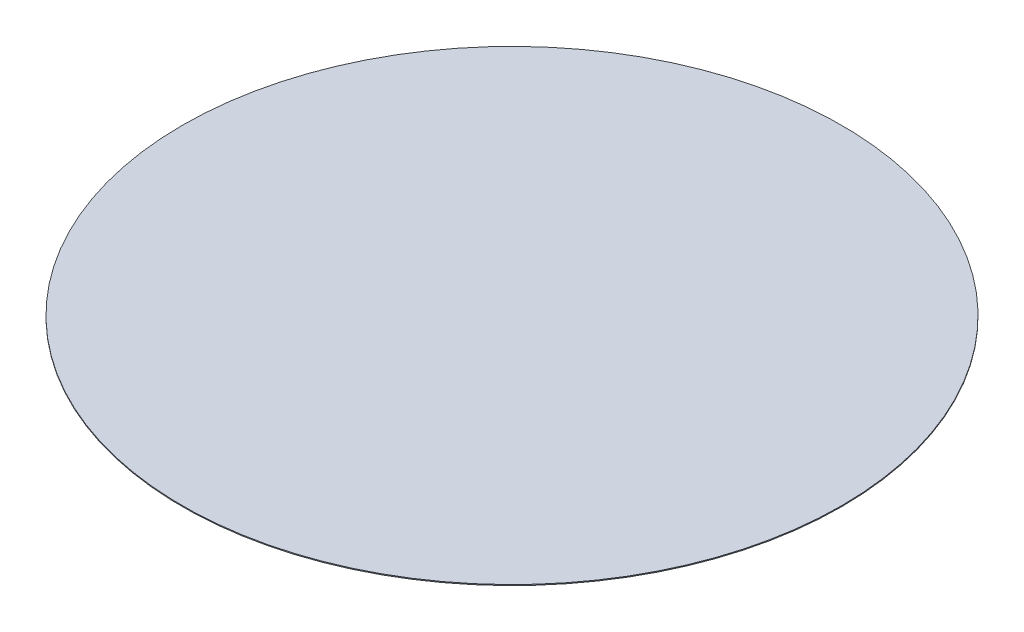
ISO-10303-21;
HEADER;
FILE_DESCRIPTION(('STEP AP214'),'2;1');
FILE_NAME('part.step','',(''),(''),'','','');
FILE_SCHEMA(('AUTOMOTIVE_DESIGN { 1 0 10303 214 1 1 1 1 }'));
ENDSEC;
DATA;
#1=APPLICATION_CONTEXT('core data for automotive mechanical design processes');
#2=APPLICATION_PROTOCOL_DEFINITION('international standard','automotive_design',2000,#1);
#3=PRODUCT_CONTEXT('',#1,'mechanical');
#4=PRODUCT('Part','Part','',(#3));
#5=PRODUCT_RELATED_PRODUCT_CATEGORY('part','',(#4));
#6=PRODUCT_DEFINITION_FORMATION('','',#4);
#7=PRODUCT_DEFINITION_CONTEXT('part definition',#1,'design');
#8=PRODUCT_DEFINITION('design','',#6,#7);
#9=PRODUCT_DEFINITION_SHAPE('','',#8);
#10=(LENGTH_UNIT() NAMED_UNIT(*) SI_UNIT(.MILLI.,.METRE.));
#11=(NAMED_UNIT(*) PLANE_ANGLE_UNIT() SI_UNIT($,.RADIAN.));
#12=(NAMED_UNIT(*) SI_UNIT($,.STERADIAN.) SOLID_ANGLE_UNIT());
#13=UNCERTAINTY_MEASURE_WITH_UNIT(LENGTH_MEASURE(1.E-05),#10,'distance_accuracy_value','');
#14=(GEOMETRIC_REPRESENTATION_CONTEXT(3) GLOBAL_UNCERTAINTY_ASSIGNED_CONTEXT((#13)) GLOBAL_UNIT_ASSIGNED_CONTEXT((#10,
#11,#12)) REPRESENTATION_CONTEXT('',''));
#15=CARTESIAN_POINT('',(0.,0.,0.));
#16=DIRECTION('',(0.,0.,1.));
#17=DIRECTION('',(1.,0.,0.));
#18=AXIS2_PLACEMENT_3D('',#15,#16,#17);
#19=CARTESIAN_POINT('',(1.66674429363955E-13,-1361.,0.));
#20=DIRECTION('',(0.,1.,0.));
#21=DIRECTION('',(-1.,0.,0.));
#22=AXIS2_PLACEMENT_3D('',#19,#20,#21);
#23=CYLINDRICAL_SURFACE('',#22,360.);
#24=CARTESIAN_POINT('',(1.66674429363955E-13,-1361.,0.));
#25=DIRECTION('',(0.,-1.,0.));
#26=DIRECTION('',(1.,0.,0.));
#27=AXIS2_PLACEMENT_3D('',#24,#25,#26);
#28=CIRCLE('',#27,360.);
#29=CARTESIAN_POINT('',(360.,-1361.,0.));
#30=VERTEX_POINT('',#29);
#31=EDGE_CURVE('E10',#30,#30,#28,.T.);
#32=ORIENTED_EDGE('',*,*,#31,.F.);
#33=EDGE_LOOP('',(#32));
#34=FACE_BOUND('',#33,.T.);
#35=CARTESIAN_POINT('',(1.6655196468404E-13,-1360.,0.));
#36=DIRECTION('',(0.,-1.,0.));
#37=DIRECTION('',(1.,0.,0.));
#38=AXIS2_PLACEMENT_3D('',#35,#36,#37);
#39=CIRCLE('',#38,360.);
#40=CARTESIAN_POINT('',(360.,-1360.,0.));
#41=VERTEX_POINT('',#40);
#42=EDGE_CURVE('E40',#41,#41,#39,.T.);
#43=ORIENTED_EDGE('',*,*,#42,.T.);
#44=EDGE_LOOP('',(#43));
#45=FACE_BOUND('',#44,.T.);
#46=ADVANCED_FACE('F37',(#34,#45),#23,.T.);
#47=CARTESIAN_POINT('',(1.66674429363955E-13,-1361.,0.));
#48=DIRECTION('',(0.,-1.,0.));
#49=DIRECTION('',(1.,0.,0.));
#50=AXIS2_PLACEMENT_3D('',#47,#48,#49);
#51=PLANE('',#50);
#52=ORIENTED_EDGE('',*,*,#31,.T.);
#53=EDGE_LOOP('',(#52));
#54=FACE_BOUND('',#53,.T.);
#55=ADVANCED_FACE('F52',(#54),#51,.T.);
#56=CARTESIAN_POINT('',(1.6655196468404E-13,-1360.,0.));
#57=DIRECTION('',(0.,-1.,0.));
#58=DIRECTION('',(1.,0.,0.));
#59=AXIS2_PLACEMENT_3D('',#56,#57,#58);
#60=PLANE('',#59);
#61=ORIENTED_EDGE('',*,*,#42,.F.);
#62=EDGE_LOOP('',(#61));
#63=FACE_BOUND('',#62,.T.);
#64=ADVANCED_FACE('F50',(#63),#60,.F.);
#65=CLOSED_SHELL('',(#46,#55,#64));
#66=MANIFOLD_SOLID_BREP('B2',#65);
#67=ADVANCED_BREP_SHAPE_REPRESENTATION('',(#18,#66),#14);
#68=SHAPE_DEFINITION_REPRESENTATION(#9,#67);
ENDSEC;
END-ISO-10303-21;
